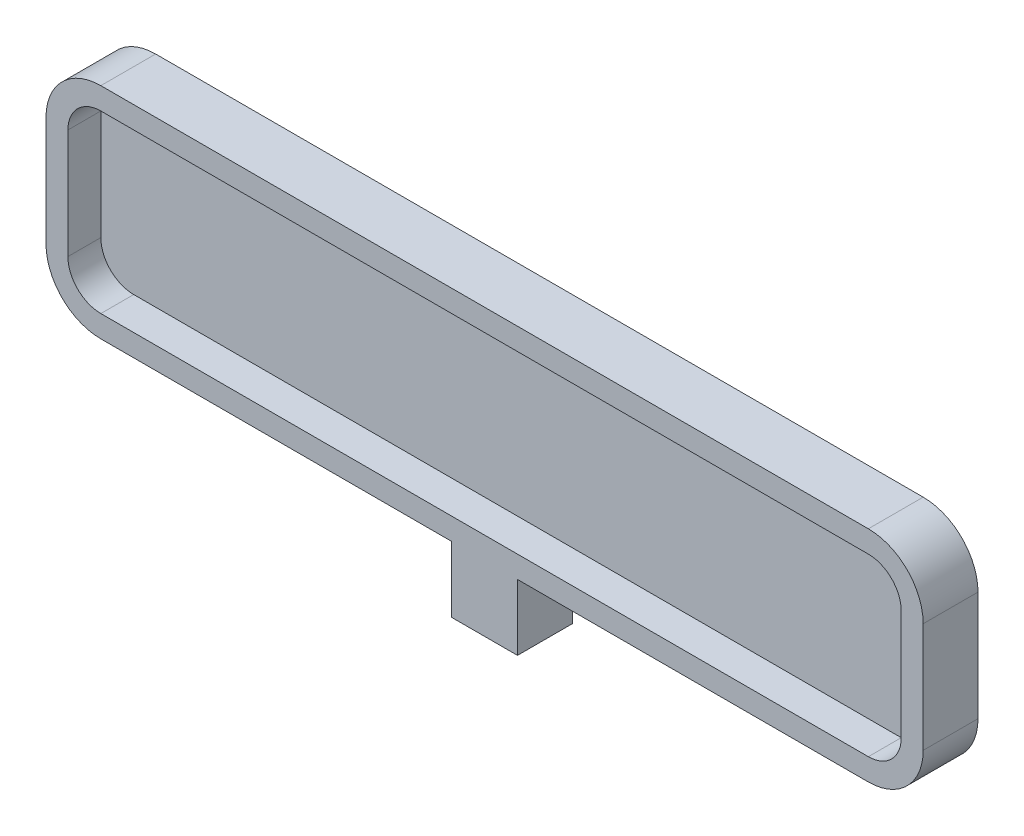
ISO-10303-21;
HEADER;
FILE_DESCRIPTION(('STEP AP214'),'2;1');
FILE_NAME('part.step','',(''),(''),'','','');
FILE_SCHEMA(('AUTOMOTIVE_DESIGN { 1 0 10303 214 1 1 1 1 }'));
ENDSEC;
DATA;
#1=APPLICATION_CONTEXT('core data for automotive mechanical design processes');
#2=APPLICATION_PROTOCOL_DEFINITION('international standard','automotive_design',2000,#1);
#3=PRODUCT_CONTEXT('',#1,'mechanical');
#4=PRODUCT('Part','Part','',(#3));
#5=PRODUCT_RELATED_PRODUCT_CATEGORY('part','',(#4));
#6=PRODUCT_DEFINITION_FORMATION('','',#4);
#7=PRODUCT_DEFINITION_CONTEXT('part definition',#1,'design');
#8=PRODUCT_DEFINITION('design','',#6,#7);
#9=PRODUCT_DEFINITION_SHAPE('','',#8);
#10=(LENGTH_UNIT() NAMED_UNIT(*) SI_UNIT(.MILLI.,.METRE.));
#11=(NAMED_UNIT(*) PLANE_ANGLE_UNIT() SI_UNIT($,.RADIAN.));
#12=(NAMED_UNIT(*) SI_UNIT($,.STERADIAN.) SOLID_ANGLE_UNIT());
#13=UNCERTAINTY_MEASURE_WITH_UNIT(LENGTH_MEASURE(1.E-05),#10,'distance_accuracy_value','');
#14=(GEOMETRIC_REPRESENTATION_CONTEXT(3) GLOBAL_UNCERTAINTY_ASSIGNED_CONTEXT((#13)) GLOBAL_UNIT_ASSIGNED_CONTEXT((#10,
#11,#12)) REPRESENTATION_CONTEXT('',''));
#15=CARTESIAN_POINT('',(0.,0.,0.));
#16=DIRECTION('',(0.,0.,1.));
#17=DIRECTION('',(1.,0.,0.));
#18=AXIS2_PLACEMENT_3D('',#15,#16,#17);
#19=CARTESIAN_POINT('',(-40.,-9.99999999999999,2.5));
#20=DIRECTION('',(0.,1.,0.));
#21=DIRECTION('',(0.,0.,1.));
#22=AXIS2_PLACEMENT_3D('',#19,#20,#21);
#23=PLANE('',#22);
#24=DIRECTION('',(0.,0.,1.));
#25=VECTOR('',#24,1.);
#26=CARTESIAN_POINT('',(3.,-9.99999999999999,-2.5));
#27=LINE('',#26,#25);
#28=CARTESIAN_POINT('',(3.,-9.99999999999999,-2.5));
#29=VERTEX_POINT('',#28);
#30=CARTESIAN_POINT('',(3.,-9.99999999999999,2.5));
#31=VERTEX_POINT('',#30);
#32=EDGE_CURVE('E202',#29,#31,#27,.T.);
#33=ORIENTED_EDGE('',*,*,#32,.F.);
#34=DIRECTION('',(1.,0.,0.));
#35=VECTOR('',#34,1.);
#36=CARTESIAN_POINT('',(-40.,-9.99999999999999,-2.5));
#37=LINE('',#36,#35);
#38=CARTESIAN_POINT('',(35.,-9.99999999999999,-2.5));
#39=VERTEX_POINT('',#38);
#40=EDGE_CURVE('E320',#29,#39,#37,.T.);
#41=ORIENTED_EDGE('',*,*,#40,.T.);
#42=DIRECTION('',(0.,0.,-1.));
#43=VECTOR('',#42,1.);
#44=CARTESIAN_POINT('',(35.,-9.99999999999999,2.5));
#45=LINE('',#44,#43);
#46=CARTESIAN_POINT('',(35.,-9.99999999999999,2.5));
#47=VERTEX_POINT('',#46);
#48=EDGE_CURVE('E338',#39,#47,#45,.F.);
#49=ORIENTED_EDGE('',*,*,#48,.T.);
#50=DIRECTION('',(1.,0.,0.));
#51=VECTOR('',#50,1.);
#52=CARTESIAN_POINT('',(-40.,-9.99999999999999,2.5));
#53=LINE('',#52,#51);
#54=EDGE_CURVE('E55',#31,#47,#53,.T.);
#55=ORIENTED_EDGE('',*,*,#54,.F.);
#56=EDGE_LOOP('',(#33,#41,#49,#55));
#57=FACE_BOUND('',#56,.T.);
#58=ADVANCED_FACE('F39',(#57),#23,.F.);
#59=DIRECTION('',(0.,0.,-1.));
#60=VECTOR('',#59,1.);
#61=CARTESIAN_POINT('',(-3.,-9.99999999999999,-2.5));
#62=LINE('',#61,#60);
#63=CARTESIAN_POINT('',(-3.,-9.99999999999999,2.5));
#64=VERTEX_POINT('',#63);
#65=CARTESIAN_POINT('',(-3.,-9.99999999999999,-2.5));
#66=VERTEX_POINT('',#65);
#67=EDGE_CURVE('E63',#64,#66,#62,.T.);
#68=ORIENTED_EDGE('',*,*,#67,.F.);
#69=CARTESIAN_POINT('',(-35.,-9.99999999999999,2.5));
#70=VERTEX_POINT('',#69);
#71=EDGE_CURVE('E306',#70,#64,#53,.T.);
#72=ORIENTED_EDGE('',*,*,#71,.F.);
#73=DIRECTION('',(0.,0.,-1.));
#74=VECTOR('',#73,1.);
#75=CARTESIAN_POINT('',(-35.,-9.99999999999999,2.5));
#76=LINE('',#75,#74);
#77=CARTESIAN_POINT('',(-35.,-9.99999999999999,-2.5));
#78=VERTEX_POINT('',#77);
#79=EDGE_CURVE('E334',#70,#78,#76,.T.);
#80=ORIENTED_EDGE('',*,*,#79,.T.);
#81=EDGE_CURVE('E300',#78,#66,#37,.T.);
#82=ORIENTED_EDGE('',*,*,#81,.T.);
#83=EDGE_LOOP('',(#68,#72,#80,#82));
#84=FACE_BOUND('',#83,.T.);
#85=ADVANCED_FACE('F442',(#84),#23,.F.);
#86=CARTESIAN_POINT('',(40.,-9.99999999999999,2.5));
#87=DIRECTION('',(-1.,0.,0.));
#88=DIRECTION('',(0.,0.,1.));
#89=AXIS2_PLACEMENT_3D('',#86,#87,#88);
#90=PLANE('',#89);
#91=DIRECTION('',(0.,1.,0.));
#92=VECTOR('',#91,1.);
#93=CARTESIAN_POINT('',(40.,-9.99999999999999,-2.5));
#94=LINE('',#93,#92);
#95=CARTESIAN_POINT('',(40.,-4.99999999999999,-2.5));
#96=VERTEX_POINT('',#95);
#97=CARTESIAN_POINT('',(40.,5.00000000000001,-2.5));
#98=VERTEX_POINT('',#97);
#99=EDGE_CURVE('E219',#96,#98,#94,.T.);
#100=ORIENTED_EDGE('',*,*,#99,.T.);
#101=DIRECTION('',(0.,0.,-1.));
#102=VECTOR('',#101,1.);
#103=CARTESIAN_POINT('',(40.,5.00000000000001,2.5));
#104=LINE('',#103,#102);
#105=CARTESIAN_POINT('',(40.,5.00000000000001,2.5));
#106=VERTEX_POINT('',#105);
#107=EDGE_CURVE('E11',#98,#106,#104,.F.);
#108=ORIENTED_EDGE('',*,*,#107,.T.);
#109=DIRECTION('',(0.,1.,0.));
#110=VECTOR('',#109,1.);
#111=CARTESIAN_POINT('',(40.,-9.99999999999999,2.5));
#112=LINE('',#111,#110);
#113=CARTESIAN_POINT('',(40.,-4.99999999999999,2.5));
#114=VERTEX_POINT('',#113);
#115=EDGE_CURVE('E295',#114,#106,#112,.T.);
#116=ORIENTED_EDGE('',*,*,#115,.F.);
#117=DIRECTION('',(0.,0.,-1.));
#118=VECTOR('',#117,1.);
#119=CARTESIAN_POINT('',(40.,-4.99999999999999,2.5));
#120=LINE('',#119,#118);
#121=EDGE_CURVE('E309',#114,#96,#120,.T.);
#122=ORIENTED_EDGE('',*,*,#121,.T.);
#123=EDGE_LOOP('',(#100,#108,#116,#122));
#124=FACE_BOUND('',#123,.T.);
#125=ADVANCED_FACE('F394',(#124),#90,.F.);
#126=CARTESIAN_POINT('',(-40.,10.,2.5));
#127=DIRECTION('',(0.,-1.,0.));
#128=DIRECTION('',(0.,0.,-1.));
#129=AXIS2_PLACEMENT_3D('',#126,#127,#128);
#130=PLANE('',#129);
#131=DIRECTION('',(-1.,0.,0.));
#132=VECTOR('',#131,1.);
#133=CARTESIAN_POINT('',(-40.,10.,-2.5));
#134=LINE('',#133,#132);
#135=CARTESIAN_POINT('',(35.,10.,-2.5));
#136=VERTEX_POINT('',#135);
#137=CARTESIAN_POINT('',(-35.,10.,-2.5));
#138=VERTEX_POINT('',#137);
#139=EDGE_CURVE('E313',#136,#138,#134,.T.);
#140=ORIENTED_EDGE('',*,*,#139,.T.);
#141=DIRECTION('',(0.,0.,-1.));
#142=VECTOR('',#141,1.);
#143=CARTESIAN_POINT('',(-35.,10.,2.5));
#144=LINE('',#143,#142);
#145=CARTESIAN_POINT('',(-35.,10.,2.5));
#146=VERTEX_POINT('',#145);
#147=EDGE_CURVE('E365',#138,#146,#144,.F.);
#148=ORIENTED_EDGE('',*,*,#147,.T.);
#149=DIRECTION('',(-1.,0.,0.));
#150=VECTOR('',#149,1.);
#151=CARTESIAN_POINT('',(-40.,10.,2.5));
#152=LINE('',#151,#150);
#153=CARTESIAN_POINT('',(35.,10.,2.5));
#154=VERTEX_POINT('',#153);
#155=EDGE_CURVE('E299',#154,#146,#152,.T.);
#156=ORIENTED_EDGE('',*,*,#155,.F.);
#157=DIRECTION('',(0.,0.,-1.));
#158=VECTOR('',#157,1.);
#159=CARTESIAN_POINT('',(35.,10.,2.5));
#160=LINE('',#159,#158);
#161=EDGE_CURVE('E361',#154,#136,#160,.T.);
#162=ORIENTED_EDGE('',*,*,#161,.T.);
#163=EDGE_LOOP('',(#140,#148,#156,#162));
#164=FACE_BOUND('',#163,.T.);
#165=ADVANCED_FACE('F387',(#164),#130,.F.);
#166=CARTESIAN_POINT('',(-40.,-9.99999999999999,2.5));
#167=DIRECTION('',(1.,0.,0.));
#168=DIRECTION('',(0.,0.,-1.));
#169=AXIS2_PLACEMENT_3D('',#166,#167,#168);
#170=PLANE('',#169);
#171=DIRECTION('',(0.,-1.,0.));
#172=VECTOR('',#171,1.);
#173=CARTESIAN_POINT('',(-40.,-9.99999999999999,2.5));
#174=LINE('',#173,#172);
#175=CARTESIAN_POINT('',(-40.,5.00000000000001,2.5));
#176=VERTEX_POINT('',#175);
#177=CARTESIAN_POINT('',(-40.,-4.99999999999999,2.5));
#178=VERTEX_POINT('',#177);
#179=EDGE_CURVE('E303',#176,#178,#174,.T.);
#180=ORIENTED_EDGE('',*,*,#179,.F.);
#181=DIRECTION('',(0.,0.,-1.));
#182=VECTOR('',#181,1.);
#183=CARTESIAN_POINT('',(-40.,5.00000000000001,2.5));
#184=LINE('',#183,#182);
#185=CARTESIAN_POINT('',(-40.,5.00000000000001,-2.5));
#186=VERTEX_POINT('',#185);
#187=EDGE_CURVE('E351',#176,#186,#184,.T.);
#188=ORIENTED_EDGE('',*,*,#187,.T.);
#189=DIRECTION('',(0.,-1.,0.));
#190=VECTOR('',#189,1.);
#191=CARTESIAN_POINT('',(-40.,-9.99999999999999,-2.5));
#192=LINE('',#191,#190);
#193=CARTESIAN_POINT('',(-40.,-4.99999999999999,-2.5));
#194=VERTEX_POINT('',#193);
#195=EDGE_CURVE('E317',#186,#194,#192,.T.);
#196=ORIENTED_EDGE('',*,*,#195,.T.);
#197=DIRECTION('',(0.,0.,-1.));
#198=VECTOR('',#197,1.);
#199=CARTESIAN_POINT('',(-40.,-4.99999999999999,2.5));
#200=LINE('',#199,#198);
#201=EDGE_CURVE('E347',#194,#178,#200,.F.);
#202=ORIENTED_EDGE('',*,*,#201,.T.);
#203=EDGE_LOOP('',(#180,#188,#196,#202));
#204=FACE_BOUND('',#203,.T.);
#205=ADVANCED_FACE('F378',(#204),#170,.F.);
#206=CARTESIAN_POINT('',(0.,0.,2.5));
#207=DIRECTION('',(0.,0.,-1.));
#208=DIRECTION('',(-1.,0.,0.));
#209=AXIS2_PLACEMENT_3D('',#206,#207,#208);
#210=PLANE('',#209);
#211=DIRECTION('',(-1.,0.,0.));
#212=VECTOR('',#211,1.);
#213=CARTESIAN_POINT('',(0.,8.00000000000001,2.5));
#214=LINE('',#213,#212);
#215=CARTESIAN_POINT('',(35.,8.00000000000001,2.5));
#216=VERTEX_POINT('',#215);
#217=CARTESIAN_POINT('',(-35.,8.00000000000001,2.5));
#218=VERTEX_POINT('',#217);
#219=EDGE_CURVE('E277',#216,#218,#214,.T.);
#220=ORIENTED_EDGE('',*,*,#219,.F.);
#221=CARTESIAN_POINT('',(35.,5.00000000000001,2.5));
#222=DIRECTION('',(0.,0.,-1.));
#223=DIRECTION('',(-1.,0.,0.));
#224=AXIS2_PLACEMENT_3D('',#221,#222,#223);
#225=CIRCLE('',#224,3.);
#226=CARTESIAN_POINT('',(38.,5.00000000000001,2.5));
#227=VERTEX_POINT('',#226);
#228=EDGE_CURVE('E256',#227,#216,#225,.F.);
#229=ORIENTED_EDGE('',*,*,#228,.F.);
#230=DIRECTION('',(0.,1.,0.));
#231=VECTOR('',#230,1.);
#232=CARTESIAN_POINT('',(38.,0.,2.5));
#233=LINE('',#232,#231);
#234=CARTESIAN_POINT('',(38.,-4.99999999999999,2.5));
#235=VERTEX_POINT('',#234);
#236=EDGE_CURVE('E249',#235,#227,#233,.T.);
#237=ORIENTED_EDGE('',*,*,#236,.F.);
#238=CARTESIAN_POINT('',(35.,-4.99999999999999,2.5));
#239=DIRECTION('',(0.,0.,-1.));
#240=DIRECTION('',(-1.,0.,0.));
#241=AXIS2_PLACEMENT_3D('',#238,#239,#240);
#242=CIRCLE('',#241,3.);
#243=CARTESIAN_POINT('',(35.,-7.99999999999999,2.5));
#244=VERTEX_POINT('',#243);
#245=EDGE_CURVE('E267',#244,#235,#242,.F.);
#246=ORIENTED_EDGE('',*,*,#245,.F.);
#247=DIRECTION('',(1.,0.,0.));
#248=VECTOR('',#247,1.);
#249=CARTESIAN_POINT('',(0.,-7.99999999999999,2.5));
#250=LINE('',#249,#248);
#251=CARTESIAN_POINT('',(-35.,-7.99999999999999,2.5));
#252=VERTEX_POINT('',#251);
#253=EDGE_CURVE('E226',#252,#244,#250,.T.);
#254=ORIENTED_EDGE('',*,*,#253,.F.);
#255=CARTESIAN_POINT('',(-35.,-4.99999999999999,2.5));
#256=DIRECTION('',(0.,0.,-1.));
#257=DIRECTION('',(-1.,0.,0.));
#258=AXIS2_PLACEMENT_3D('',#255,#256,#257);
#259=CIRCLE('',#258,3.);
#260=CARTESIAN_POINT('',(-38.,-4.99999999999999,2.5));
#261=VERTEX_POINT('',#260);
#262=EDGE_CURVE('E274',#261,#252,#259,.F.);
#263=ORIENTED_EDGE('',*,*,#262,.F.);
#264=DIRECTION('',(0.,-1.,0.));
#265=VECTOR('',#264,1.);
#266=CARTESIAN_POINT('',(-38.,0.,2.5));
#267=LINE('',#266,#265);
#268=CARTESIAN_POINT('',(-38.,5.00000000000001,2.5));
#269=VERTEX_POINT('',#268);
#270=EDGE_CURVE('E283',#269,#261,#267,.T.);
#271=ORIENTED_EDGE('',*,*,#270,.F.);
#272=CARTESIAN_POINT('',(-35.,5.00000000000001,2.5));
#273=DIRECTION('',(0.,0.,-1.));
#274=DIRECTION('',(-1.,0.,0.));
#275=AXIS2_PLACEMENT_3D('',#272,#273,#274);
#276=CIRCLE('',#275,3.);
#277=EDGE_CURVE('E220',#218,#269,#276,.F.);
#278=ORIENTED_EDGE('',*,*,#277,.F.);
#279=EDGE_LOOP('',(#220,#229,#237,#246,#254,#263,#271,#278));
#280=FACE_BOUND('',#279,.T.);
#281=ORIENTED_EDGE('',*,*,#155,.T.);
#282=CARTESIAN_POINT('',(-35.,5.00000000000001,2.5));
#283=DIRECTION('',(0.,0.,-1.));
#284=DIRECTION('',(-1.,0.,0.));
#285=AXIS2_PLACEMENT_3D('',#282,#283,#284);
#286=CIRCLE('',#285,5.);
#287=EDGE_CURVE('E48',#146,#176,#286,.F.);
#288=ORIENTED_EDGE('',*,*,#287,.T.);
#289=ORIENTED_EDGE('',*,*,#179,.T.);
#290=CARTESIAN_POINT('',(-35.,-4.99999999999999,2.5));
#291=DIRECTION('',(0.,0.,-1.));
#292=DIRECTION('',(-1.,0.,0.));
#293=AXIS2_PLACEMENT_3D('',#290,#291,#292);
#294=CIRCLE('',#293,5.);
#295=EDGE_CURVE('E341',#178,#70,#294,.F.);
#296=ORIENTED_EDGE('',*,*,#295,.T.);
#297=ORIENTED_EDGE('',*,*,#71,.T.);
#298=DIRECTION('',(0.,1.,0.));
#299=VECTOR('',#298,1.);
#300=CARTESIAN_POINT('',(-3.,-16.,2.5));
#301=LINE('',#300,#299);
#302=CARTESIAN_POINT('',(-3.,-16.,2.5));
#303=VERTEX_POINT('',#302);
#304=EDGE_CURVE('E185',#303,#64,#301,.T.);
#305=ORIENTED_EDGE('',*,*,#304,.F.);
#306=DIRECTION('',(-1.,0.,0.));
#307=VECTOR('',#306,1.);
#308=CARTESIAN_POINT('',(-3.,-16.,2.5));
#309=LINE('',#308,#307);
#310=CARTESIAN_POINT('',(3.,-16.,2.5));
#311=VERTEX_POINT('',#310);
#312=EDGE_CURVE('E177',#311,#303,#309,.T.);
#313=ORIENTED_EDGE('',*,*,#312,.F.);
#314=DIRECTION('',(0.,1.,0.));
#315=VECTOR('',#314,1.);
#316=CARTESIAN_POINT('',(3.,-16.,2.5));
#317=LINE('',#316,#315);
#318=EDGE_CURVE('E182',#311,#31,#317,.T.);
#319=ORIENTED_EDGE('',*,*,#318,.T.);
#320=ORIENTED_EDGE('',*,*,#54,.T.);
#321=CARTESIAN_POINT('',(35.,-4.99999999999999,2.5));
#322=DIRECTION('',(0.,0.,-1.));
#323=DIRECTION('',(-1.,0.,0.));
#324=AXIS2_PLACEMENT_3D('',#321,#322,#323);
#325=CIRCLE('',#324,5.);
#326=EDGE_CURVE('E344',#47,#114,#325,.F.);
#327=ORIENTED_EDGE('',*,*,#326,.T.);
#328=ORIENTED_EDGE('',*,*,#115,.T.);
#329=CARTESIAN_POINT('',(35.,5.00000000000001,2.5));
#330=DIRECTION('',(0.,0.,-1.));
#331=DIRECTION('',(-1.,0.,0.));
#332=AXIS2_PLACEMENT_3D('',#329,#330,#331);
#333=CIRCLE('',#332,5.);
#334=EDGE_CURVE('E368',#106,#154,#333,.F.);
#335=ORIENTED_EDGE('',*,*,#334,.T.);
#336=EDGE_LOOP('',(#281,#288,#289,#296,#297,#305,#313,#319,#320,#327,#328,#335));
#337=FACE_BOUND('',#336,.T.);
#338=ADVANCED_FACE('F180',(#280,#337),#210,.F.);
#339=CARTESIAN_POINT('',(0.,0.,-2.5));
#340=DIRECTION('',(0.,0.,-1.));
#341=DIRECTION('',(-1.,0.,0.));
#342=AXIS2_PLACEMENT_3D('',#339,#340,#341);
#343=PLANE('',#342);
#344=ORIENTED_EDGE('',*,*,#195,.F.);
#345=CARTESIAN_POINT('',(-35.,5.00000000000001,-2.5));
#346=DIRECTION('',(0.,0.,-1.));
#347=DIRECTION('',(-1.,0.,0.));
#348=AXIS2_PLACEMENT_3D('',#345,#346,#347);
#349=CIRCLE('',#348,5.);
#350=EDGE_CURVE('E358',#186,#138,#349,.T.);
#351=ORIENTED_EDGE('',*,*,#350,.T.);
#352=ORIENTED_EDGE('',*,*,#139,.F.);
#353=CARTESIAN_POINT('',(35.,5.00000000000001,-2.5));
#354=DIRECTION('',(0.,0.,-1.));
#355=DIRECTION('',(-1.,0.,0.));
#356=AXIS2_PLACEMENT_3D('',#353,#354,#355);
#357=CIRCLE('',#356,5.);
#358=EDGE_CURVE('E355',#136,#98,#357,.T.);
#359=ORIENTED_EDGE('',*,*,#358,.T.);
#360=ORIENTED_EDGE('',*,*,#99,.F.);
#361=CARTESIAN_POINT('',(35.,-4.99999999999999,-2.5));
#362=DIRECTION('',(0.,0.,-1.));
#363=DIRECTION('',(-1.,0.,0.));
#364=AXIS2_PLACEMENT_3D('',#361,#362,#363);
#365=CIRCLE('',#364,5.);
#366=EDGE_CURVE('E330',#96,#39,#365,.T.);
#367=ORIENTED_EDGE('',*,*,#366,.T.);
#368=ORIENTED_EDGE('',*,*,#40,.F.);
#369=DIRECTION('',(0.,1.,0.));
#370=VECTOR('',#369,1.);
#371=CARTESIAN_POINT('',(3.,-16.,-2.5));
#372=LINE('',#371,#370);
#373=CARTESIAN_POINT('',(3.,-16.,-2.5));
#374=VERTEX_POINT('',#373);
#375=EDGE_CURVE('E401',#374,#29,#372,.T.);
#376=ORIENTED_EDGE('',*,*,#375,.F.);
#377=DIRECTION('',(1.,0.,0.));
#378=VECTOR('',#377,1.);
#379=CARTESIAN_POINT('',(-3.,-16.,-2.5));
#380=LINE('',#379,#378);
#381=CARTESIAN_POINT('',(-3.,-16.,-2.5));
#382=VERTEX_POINT('',#381);
#383=EDGE_CURVE('E195',#382,#374,#380,.T.);
#384=ORIENTED_EDGE('',*,*,#383,.F.);
#385=DIRECTION('',(0.,1.,0.));
#386=VECTOR('',#385,1.);
#387=CARTESIAN_POINT('',(-3.,-16.,-2.5));
#388=LINE('',#387,#386);
#389=EDGE_CURVE('E211',#382,#66,#388,.T.);
#390=ORIENTED_EDGE('',*,*,#389,.T.);
#391=ORIENTED_EDGE('',*,*,#81,.F.);
#392=CARTESIAN_POINT('',(-35.,-4.99999999999999,-2.5));
#393=DIRECTION('',(0.,0.,-1.));
#394=DIRECTION('',(-1.,0.,0.));
#395=AXIS2_PLACEMENT_3D('',#392,#393,#394);
#396=CIRCLE('',#395,5.);
#397=EDGE_CURVE('E326',#78,#194,#396,.T.);
#398=ORIENTED_EDGE('',*,*,#397,.T.);
#399=EDGE_LOOP('',(#344,#351,#352,#359,#360,#367,#368,#376,#384,#390,#391,#398));
#400=FACE_BOUND('',#399,.T.);
#401=ADVANCED_FACE('F385',(#400),#343,.T.);
#402=CARTESIAN_POINT('',(35.,-4.99999999999999,2.5));
#403=DIRECTION('',(0.,0.,-1.));
#404=DIRECTION('',(-1.,0.,0.));
#405=AXIS2_PLACEMENT_3D('',#402,#403,#404);
#406=CYLINDRICAL_SURFACE('',#405,5.);
#407=ORIENTED_EDGE('',*,*,#326,.F.);
#408=ORIENTED_EDGE('',*,*,#48,.F.);
#409=ORIENTED_EDGE('',*,*,#366,.F.);
#410=ORIENTED_EDGE('',*,*,#121,.F.);
#411=EDGE_LOOP('',(#407,#408,#409,#410));
#412=FACE_BOUND('',#411,.T.);
#413=ADVANCED_FACE('F399',(#412),#406,.T.);
#414=CARTESIAN_POINT('',(-35.,-4.99999999999999,2.5));
#415=DIRECTION('',(0.,0.,-1.));
#416=DIRECTION('',(-1.,0.,0.));
#417=AXIS2_PLACEMENT_3D('',#414,#415,#416);
#418=CYLINDRICAL_SURFACE('',#417,5.);
#419=ORIENTED_EDGE('',*,*,#295,.F.);
#420=ORIENTED_EDGE('',*,*,#201,.F.);
#421=ORIENTED_EDGE('',*,*,#397,.F.);
#422=ORIENTED_EDGE('',*,*,#79,.F.);
#423=EDGE_LOOP('',(#419,#420,#421,#422));
#424=FACE_BOUND('',#423,.T.);
#425=ADVANCED_FACE('F458',(#424),#418,.T.);
#426=CARTESIAN_POINT('',(-35.,5.00000000000001,2.5));
#427=DIRECTION('',(0.,0.,-1.));
#428=DIRECTION('',(-1.,0.,0.));
#429=AXIS2_PLACEMENT_3D('',#426,#427,#428);
#430=CYLINDRICAL_SURFACE('',#429,5.);
#431=ORIENTED_EDGE('',*,*,#287,.F.);
#432=ORIENTED_EDGE('',*,*,#147,.F.);
#433=ORIENTED_EDGE('',*,*,#350,.F.);
#434=ORIENTED_EDGE('',*,*,#187,.F.);
#435=EDGE_LOOP('',(#431,#432,#433,#434));
#436=FACE_BOUND('',#435,.T.);
#437=ADVANCED_FACE('F382',(#436),#430,.T.);
#438=CARTESIAN_POINT('',(35.,5.00000000000001,2.5));
#439=DIRECTION('',(0.,0.,-1.));
#440=DIRECTION('',(-1.,0.,0.));
#441=AXIS2_PLACEMENT_3D('',#438,#439,#440);
#442=CYLINDRICAL_SURFACE('',#441,5.);
#443=ORIENTED_EDGE('',*,*,#334,.F.);
#444=ORIENTED_EDGE('',*,*,#107,.F.);
#445=ORIENTED_EDGE('',*,*,#358,.F.);
#446=ORIENTED_EDGE('',*,*,#161,.F.);
#447=EDGE_LOOP('',(#443,#444,#445,#446));
#448=FACE_BOUND('',#447,.T.);
#449=ADVANCED_FACE('F41',(#448),#442,.T.);
#450=CARTESIAN_POINT('',(38.,-9.99999999999999,2.5));
#451=DIRECTION('',(-1.,0.,0.));
#452=DIRECTION('',(0.,0.,1.));
#453=AXIS2_PLACEMENT_3D('',#450,#451,#452);
#454=PLANE('',#453);
#455=DIRECTION('',(0.,1.,0.));
#456=VECTOR('',#455,1.);
#457=CARTESIAN_POINT('',(38.,0.,-0.5));
#458=LINE('',#457,#456);
#459=CARTESIAN_POINT('',(38.,-4.99999999999999,-0.5));
#460=VERTEX_POINT('',#459);
#461=CARTESIAN_POINT('',(38.,5.00000000000001,-0.5));
#462=VERTEX_POINT('',#461);
#463=EDGE_CURVE('E204',#460,#462,#458,.T.);
#464=ORIENTED_EDGE('',*,*,#463,.F.);
#465=DIRECTION('',(0.,0.,1.));
#466=VECTOR('',#465,1.);
#467=CARTESIAN_POINT('',(38.,-4.99999999999999,2.5));
#468=LINE('',#467,#466);
#469=EDGE_CURVE('E221',#235,#460,#468,.F.);
#470=ORIENTED_EDGE('',*,*,#469,.F.);
#471=ORIENTED_EDGE('',*,*,#236,.T.);
#472=DIRECTION('',(0.,0.,1.));
#473=VECTOR('',#472,1.);
#474=CARTESIAN_POINT('',(38.,5.00000000000001,2.5));
#475=LINE('',#474,#473);
#476=EDGE_CURVE('E215',#462,#227,#475,.T.);
#477=ORIENTED_EDGE('',*,*,#476,.F.);
#478=EDGE_LOOP('',(#464,#470,#471,#477));
#479=FACE_BOUND('',#478,.T.);
#480=ADVANCED_FACE('F465',(#479),#454,.T.);
#481=CARTESIAN_POINT('',(-40.,8.00000000000001,2.5));
#482=DIRECTION('',(0.,-1.,0.));
#483=DIRECTION('',(0.,0.,-1.));
#484=AXIS2_PLACEMENT_3D('',#481,#482,#483);
#485=PLANE('',#484);
#486=DIRECTION('',(-1.,0.,0.));
#487=VECTOR('',#486,1.);
#488=CARTESIAN_POINT('',(0.,8.00000000000001,-0.5));
#489=LINE('',#488,#487);
#490=CARTESIAN_POINT('',(35.,8.00000000000001,-0.5));
#491=VERTEX_POINT('',#490);
#492=CARTESIAN_POINT('',(-35.,8.00000000000001,-0.5));
#493=VERTEX_POINT('',#492);
#494=EDGE_CURVE('E209',#491,#493,#489,.T.);
#495=ORIENTED_EDGE('',*,*,#494,.F.);
#496=DIRECTION('',(0.,0.,-1.));
#497=VECTOR('',#496,1.);
#498=CARTESIAN_POINT('',(35.,8.00000000000001,2.5));
#499=LINE('',#498,#497);
#500=EDGE_CURVE('E234',#216,#491,#499,.T.);
#501=ORIENTED_EDGE('',*,*,#500,.F.);
#502=ORIENTED_EDGE('',*,*,#219,.T.);
#503=DIRECTION('',(0.,0.,-1.));
#504=VECTOR('',#503,1.);
#505=CARTESIAN_POINT('',(-35.,8.00000000000001,2.5));
#506=LINE('',#505,#504);
#507=EDGE_CURVE('E253',#493,#218,#506,.F.);
#508=ORIENTED_EDGE('',*,*,#507,.F.);
#509=EDGE_LOOP('',(#495,#501,#502,#508));
#510=FACE_BOUND('',#509,.T.);
#511=ADVANCED_FACE('F469',(#510),#485,.T.);
#512=CARTESIAN_POINT('',(-38.,-9.99999999999999,2.5));
#513=DIRECTION('',(1.,0.,0.));
#514=DIRECTION('',(0.,0.,-1.));
#515=AXIS2_PLACEMENT_3D('',#512,#513,#514);
#516=PLANE('',#515);
#517=ORIENTED_EDGE('',*,*,#270,.T.);
#518=DIRECTION('',(0.,0.,-1.));
#519=VECTOR('',#518,1.);
#520=CARTESIAN_POINT('',(-38.,-4.99999999999999,2.5));
#521=LINE('',#520,#519);
#522=CARTESIAN_POINT('',(-38.,-4.99999999999999,-0.5));
#523=VERTEX_POINT('',#522);
#524=EDGE_CURVE('E263',#523,#261,#521,.F.);
#525=ORIENTED_EDGE('',*,*,#524,.F.);
#526=DIRECTION('',(0.,-1.,0.));
#527=VECTOR('',#526,1.);
#528=CARTESIAN_POINT('',(-38.,0.,-0.5));
#529=LINE('',#528,#527);
#530=CARTESIAN_POINT('',(-38.,5.00000000000001,-0.5));
#531=VERTEX_POINT('',#530);
#532=EDGE_CURVE('E227',#531,#523,#529,.T.);
#533=ORIENTED_EDGE('',*,*,#532,.F.);
#534=DIRECTION('',(0.,0.,-1.));
#535=VECTOR('',#534,1.);
#536=CARTESIAN_POINT('',(-38.,5.00000000000001,2.5));
#537=LINE('',#536,#535);
#538=EDGE_CURVE('E241',#269,#531,#537,.T.);
#539=ORIENTED_EDGE('',*,*,#538,.F.);
#540=EDGE_LOOP('',(#517,#525,#533,#539));
#541=FACE_BOUND('',#540,.T.);
#542=ADVANCED_FACE('F475',(#541),#516,.T.);
#543=CARTESIAN_POINT('',(-40.,-7.99999999999999,2.5));
#544=DIRECTION('',(0.,1.,0.));
#545=DIRECTION('',(0.,0.,1.));
#546=AXIS2_PLACEMENT_3D('',#543,#544,#545);
#547=PLANE('',#546);
#548=DIRECTION('',(1.,0.,0.));
#549=VECTOR('',#548,1.);
#550=CARTESIAN_POINT('',(0.,-7.99999999999999,-0.5));
#551=LINE('',#550,#549);
#552=CARTESIAN_POINT('',(-35.,-7.99999999999999,-0.5));
#553=VERTEX_POINT('',#552);
#554=CARTESIAN_POINT('',(35.,-7.99999999999999,-0.5));
#555=VERTEX_POINT('',#554);
#556=EDGE_CURVE('E230',#553,#555,#551,.T.);
#557=ORIENTED_EDGE('',*,*,#556,.F.);
#558=DIRECTION('',(0.,0.,1.));
#559=VECTOR('',#558,1.);
#560=CARTESIAN_POINT('',(-35.,-7.99999999999999,2.5));
#561=LINE('',#560,#559);
#562=EDGE_CURVE('E245',#252,#553,#561,.F.);
#563=ORIENTED_EDGE('',*,*,#562,.F.);
#564=ORIENTED_EDGE('',*,*,#253,.T.);
#565=DIRECTION('',(0.,0.,1.));
#566=VECTOR('',#565,1.);
#567=CARTESIAN_POINT('',(35.,-7.99999999999999,2.5));
#568=LINE('',#567,#566);
#569=EDGE_CURVE('E271',#555,#244,#568,.T.);
#570=ORIENTED_EDGE('',*,*,#569,.F.);
#571=EDGE_LOOP('',(#557,#563,#564,#570));
#572=FACE_BOUND('',#571,.T.);
#573=ADVANCED_FACE('F483',(#572),#547,.T.);
#574=CARTESIAN_POINT('',(0.,0.,-0.5));
#575=DIRECTION('',(0.,0.,-1.));
#576=DIRECTION('',(-1.,0.,0.));
#577=AXIS2_PLACEMENT_3D('',#574,#575,#576);
#578=PLANE('',#577);
#579=ORIENTED_EDGE('',*,*,#532,.T.);
#580=CARTESIAN_POINT('',(-35.,-4.99999999999999,-0.5));
#581=DIRECTION('',(0.,0.,-1.));
#582=DIRECTION('',(-1.,0.,0.));
#583=AXIS2_PLACEMENT_3D('',#580,#581,#582);
#584=CIRCLE('',#583,3.);
#585=EDGE_CURVE('E225',#553,#523,#584,.T.);
#586=ORIENTED_EDGE('',*,*,#585,.F.);
#587=ORIENTED_EDGE('',*,*,#556,.T.);
#588=CARTESIAN_POINT('',(35.,-4.99999999999999,-0.5));
#589=DIRECTION('',(0.,0.,-1.));
#590=DIRECTION('',(-1.,0.,0.));
#591=AXIS2_PLACEMENT_3D('',#588,#589,#590);
#592=CIRCLE('',#591,3.);
#593=EDGE_CURVE('E242',#460,#555,#592,.T.);
#594=ORIENTED_EDGE('',*,*,#593,.F.);
#595=ORIENTED_EDGE('',*,*,#463,.T.);
#596=CARTESIAN_POINT('',(35.,5.00000000000001,-0.5));
#597=DIRECTION('',(0.,0.,-1.));
#598=DIRECTION('',(-1.,0.,0.));
#599=AXIS2_PLACEMENT_3D('',#596,#597,#598);
#600=CIRCLE('',#599,3.);
#601=EDGE_CURVE('E235',#491,#462,#600,.T.);
#602=ORIENTED_EDGE('',*,*,#601,.F.);
#603=ORIENTED_EDGE('',*,*,#494,.T.);
#604=CARTESIAN_POINT('',(-35.,5.00000000000001,-0.5));
#605=DIRECTION('',(0.,0.,-1.));
#606=DIRECTION('',(-1.,0.,0.));
#607=AXIS2_PLACEMENT_3D('',#604,#605,#606);
#608=CIRCLE('',#607,3.);
#609=EDGE_CURVE('E231',#531,#493,#608,.T.);
#610=ORIENTED_EDGE('',*,*,#609,.F.);
#611=EDGE_LOOP('',(#579,#586,#587,#594,#595,#602,#603,#610));
#612=FACE_BOUND('',#611,.T.);
#613=ADVANCED_FACE('F487',(#612),#578,.F.);
#614=CARTESIAN_POINT('',(35.,-4.99999999999999,2.5));
#615=DIRECTION('',(0.,0.,-1.));
#616=DIRECTION('',(-1.,0.,0.));
#617=AXIS2_PLACEMENT_3D('',#614,#615,#616);
#618=CYLINDRICAL_SURFACE('',#617,3.);
#619=ORIENTED_EDGE('',*,*,#245,.T.);
#620=ORIENTED_EDGE('',*,*,#469,.T.);
#621=ORIENTED_EDGE('',*,*,#593,.T.);
#622=ORIENTED_EDGE('',*,*,#569,.T.);
#623=EDGE_LOOP('',(#619,#620,#621,#622));
#624=FACE_BOUND('',#623,.T.);
#625=ADVANCED_FACE('F491',(#624),#618,.F.);
#626=CARTESIAN_POINT('',(-35.,-4.99999999999999,2.5));
#627=DIRECTION('',(0.,0.,-1.));
#628=DIRECTION('',(-1.,0.,0.));
#629=AXIS2_PLACEMENT_3D('',#626,#627,#628);
#630=CYLINDRICAL_SURFACE('',#629,3.);
#631=ORIENTED_EDGE('',*,*,#262,.T.);
#632=ORIENTED_EDGE('',*,*,#562,.T.);
#633=ORIENTED_EDGE('',*,*,#585,.T.);
#634=ORIENTED_EDGE('',*,*,#524,.T.);
#635=EDGE_LOOP('',(#631,#632,#633,#634));
#636=FACE_BOUND('',#635,.T.);
#637=ADVANCED_FACE('F495',(#636),#630,.F.);
#638=CARTESIAN_POINT('',(-35.,5.00000000000001,2.5));
#639=DIRECTION('',(0.,0.,-1.));
#640=DIRECTION('',(-1.,0.,0.));
#641=AXIS2_PLACEMENT_3D('',#638,#639,#640);
#642=CYLINDRICAL_SURFACE('',#641,3.);
#643=ORIENTED_EDGE('',*,*,#277,.T.);
#644=ORIENTED_EDGE('',*,*,#538,.T.);
#645=ORIENTED_EDGE('',*,*,#609,.T.);
#646=ORIENTED_EDGE('',*,*,#507,.T.);
#647=EDGE_LOOP('',(#643,#644,#645,#646));
#648=FACE_BOUND('',#647,.T.);
#649=ADVANCED_FACE('F499',(#648),#642,.F.);
#650=CARTESIAN_POINT('',(35.,5.00000000000001,2.5));
#651=DIRECTION('',(0.,0.,-1.));
#652=DIRECTION('',(-1.,0.,0.));
#653=AXIS2_PLACEMENT_3D('',#650,#651,#652);
#654=CYLINDRICAL_SURFACE('',#653,3.);
#655=ORIENTED_EDGE('',*,*,#228,.T.);
#656=ORIENTED_EDGE('',*,*,#500,.T.);
#657=ORIENTED_EDGE('',*,*,#601,.T.);
#658=ORIENTED_EDGE('',*,*,#476,.T.);
#659=EDGE_LOOP('',(#655,#656,#657,#658));
#660=FACE_BOUND('',#659,.T.);
#661=ADVANCED_FACE('F503',(#660),#654,.F.);
#662=CARTESIAN_POINT('',(3.,-16.,-2.5));
#663=DIRECTION('',(-1.,0.,0.));
#664=DIRECTION('',(0.,0.,1.));
#665=AXIS2_PLACEMENT_3D('',#662,#663,#664);
#666=PLANE('',#665);
#667=ORIENTED_EDGE('',*,*,#32,.T.);
#668=ORIENTED_EDGE('',*,*,#318,.F.);
#669=DIRECTION('',(0.,0.,1.));
#670=VECTOR('',#669,1.);
#671=CARTESIAN_POINT('',(3.,-16.,-2.5));
#672=LINE('',#671,#670);
#673=EDGE_CURVE('E190',#374,#311,#672,.T.);
#674=ORIENTED_EDGE('',*,*,#673,.F.);
#675=ORIENTED_EDGE('',*,*,#375,.T.);
#676=EDGE_LOOP('',(#667,#668,#674,#675));
#677=FACE_BOUND('',#676,.T.);
#678=ADVANCED_FACE('F201',(#677),#666,.F.);
#679=CARTESIAN_POINT('',(-3.,-16.,-2.5));
#680=DIRECTION('',(1.,0.,0.));
#681=DIRECTION('',(0.,0.,-1.));
#682=AXIS2_PLACEMENT_3D('',#679,#680,#681);
#683=PLANE('',#682);
#684=ORIENTED_EDGE('',*,*,#67,.T.);
#685=ORIENTED_EDGE('',*,*,#389,.F.);
#686=DIRECTION('',(0.,0.,-1.));
#687=VECTOR('',#686,1.);
#688=CARTESIAN_POINT('',(-3.,-16.,-2.5));
#689=LINE('',#688,#687);
#690=EDGE_CURVE('E189',#303,#382,#689,.T.);
#691=ORIENTED_EDGE('',*,*,#690,.F.);
#692=ORIENTED_EDGE('',*,*,#304,.T.);
#693=EDGE_LOOP('',(#684,#685,#691,#692));
#694=FACE_BOUND('',#693,.T.);
#695=ADVANCED_FACE('F434',(#694),#683,.F.);
#696=CARTESIAN_POINT('',(0.,-16.,0.));
#697=DIRECTION('',(0.,1.,0.));
#698=DIRECTION('',(0.,0.,1.));
#699=AXIS2_PLACEMENT_3D('',#696,#697,#698);
#700=PLANE('',#699);
#701=CARTESIAN_POINT('',(0.,-16.,0.));
#702=DIRECTION('',(0.,-1.,0.));
#703=DIRECTION('',(0.,0.,-1.));
#704=AXIS2_PLACEMENT_3D('',#701,#702,#703);
#705=CIRCLE('',#704,1.425);
#706=CARTESIAN_POINT('',(0.,-16.,-1.425));
#707=VERTEX_POINT('',#706);
#708=EDGE_CURVE('E417',#707,#707,#705,.T.);
#709=ORIENTED_EDGE('',*,*,#708,.F.);
#710=EDGE_LOOP('',(#709));
#711=FACE_BOUND('',#710,.T.);
#712=ORIENTED_EDGE('',*,*,#673,.T.);
#713=ORIENTED_EDGE('',*,*,#312,.T.);
#714=ORIENTED_EDGE('',*,*,#690,.T.);
#715=ORIENTED_EDGE('',*,*,#383,.T.);
#716=EDGE_LOOP('',(#712,#713,#714,#715));
#717=FACE_BOUND('',#716,.T.);
#718=ADVANCED_FACE('F193',(#711,#717),#700,.F.);
#719=CARTESIAN_POINT('',(0.,-12.,0.));
#720=DIRECTION('',(0.,-1.,0.));
#721=DIRECTION('',(0.,0.,-1.));
#722=AXIS2_PLACEMENT_3D('',#719,#720,#721);
#723=CYLINDRICAL_SURFACE('',#722,1.425);
#724=CARTESIAN_POINT('',(0.,-12.,0.));
#725=DIRECTION('',(0.,-1.,0.));
#726=DIRECTION('',(0.,0.,-1.));
#727=AXIS2_PLACEMENT_3D('',#724,#725,#726);
#728=CIRCLE('',#727,1.425);
#729=CARTESIAN_POINT('',(0.,-12.,-1.425));
#730=VERTEX_POINT('',#729);
#731=EDGE_CURVE('E404',#730,#730,#728,.T.);
#732=ORIENTED_EDGE('',*,*,#731,.F.);
#733=EDGE_LOOP('',(#732));
#734=FACE_BOUND('',#733,.T.);
#735=ORIENTED_EDGE('',*,*,#708,.T.);
#736=EDGE_LOOP('',(#735));
#737=FACE_BOUND('',#736,.T.);
#738=ADVANCED_FACE('F427',(#734,#737),#723,.F.);
#739=CARTESIAN_POINT('',(0.,-12.,0.));
#740=DIRECTION('',(0.,-1.,0.));
#741=DIRECTION('',(0.,0.,-1.));
#742=AXIS2_PLACEMENT_3D('',#739,#740,#741);
#743=PLANE('',#742);
#744=ORIENTED_EDGE('',*,*,#731,.T.);
#745=EDGE_LOOP('',(#744));
#746=FACE_BOUND('',#745,.T.);
#747=ADVANCED_FACE('F425',(#746),#743,.T.);
#748=CLOSED_SHELL('',(#58,#85,#125,#165,#205,#338,#401,#413,#425,#437,#449,#480,#511,#542,#573,
#613,#625,#637,#649,#661,#678,#695,#718,#738,#747));
#749=MANIFOLD_SOLID_BREP('B2',#748);
#750=ADVANCED_BREP_SHAPE_REPRESENTATION('',(#18,#749),#14);
#751=SHAPE_DEFINITION_REPRESENTATION(#9,#750);
ENDSEC;
END-ISO-10303-21;
